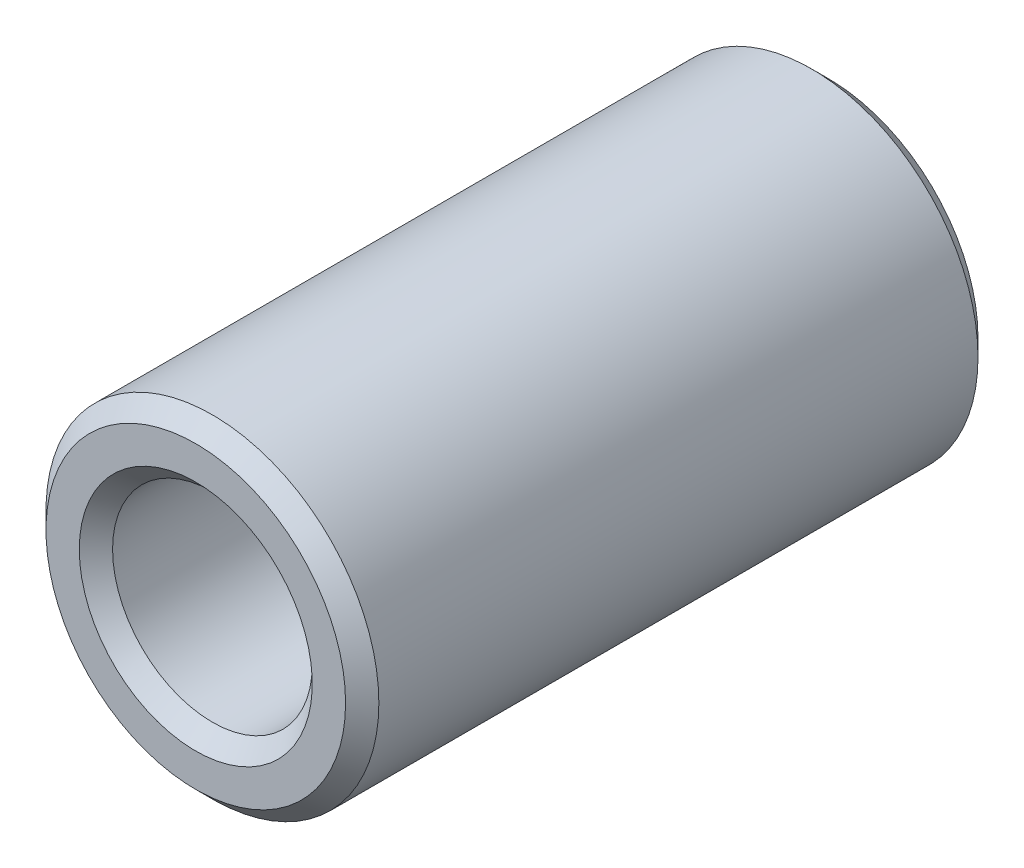
ISO-10303-21;
HEADER;
FILE_DESCRIPTION(('STEP AP214'),'2;1');
FILE_NAME('part.step','',(''),(''),'','','');
FILE_SCHEMA(('AUTOMOTIVE_DESIGN { 1 0 10303 214 1 1 1 1 }'));
ENDSEC;
DATA;
#1=APPLICATION_CONTEXT('core data for automotive mechanical design processes');
#2=APPLICATION_PROTOCOL_DEFINITION('international standard','automotive_design',2000,#1);
#3=PRODUCT_CONTEXT('',#1,'mechanical');
#4=PRODUCT('Part','Part','',(#3));
#5=PRODUCT_RELATED_PRODUCT_CATEGORY('part','',(#4));
#6=PRODUCT_DEFINITION_FORMATION('','',#4);
#7=PRODUCT_DEFINITION_CONTEXT('part definition',#1,'design');
#8=PRODUCT_DEFINITION('design','',#6,#7);
#9=PRODUCT_DEFINITION_SHAPE('','',#8);
#10=(LENGTH_UNIT() NAMED_UNIT(*) SI_UNIT(.MILLI.,.METRE.));
#11=(NAMED_UNIT(*) PLANE_ANGLE_UNIT() SI_UNIT($,.RADIAN.));
#12=(NAMED_UNIT(*) SI_UNIT($,.STERADIAN.) SOLID_ANGLE_UNIT());
#13=UNCERTAINTY_MEASURE_WITH_UNIT(LENGTH_MEASURE(1.E-05),#10,'distance_accuracy_value','');
#14=(GEOMETRIC_REPRESENTATION_CONTEXT(3) GLOBAL_UNCERTAINTY_ASSIGNED_CONTEXT((#13)) GLOBAL_UNIT_ASSIGNED_CONTEXT((#10,
#11,#12)) REPRESENTATION_CONTEXT('',''));
#15=CARTESIAN_POINT('',(0.,0.,0.));
#16=DIRECTION('',(0.,0.,1.));
#17=DIRECTION('',(1.,0.,0.));
#18=AXIS2_PLACEMENT_3D('',#15,#16,#17);
#19=CARTESIAN_POINT('',(3.,0.,-0.5));
#20=CARTESIAN_POINT('',(3.,0.,-18.5));
#21=(BOUNDED_CURVE() B_SPLINE_CURVE(1,(#19,#20),.UNSPECIFIED.,.F.,
.F.) B_SPLINE_CURVE_WITH_KNOTS((2,2),(0.,1.),
.UNSPECIFIED.) CURVE() GEOMETRIC_REPRESENTATION_ITEM() RATIONAL_B_SPLINE_CURVE((1.,1.)) REPRESENTATION_ITEM(''));
#22=CARTESIAN_POINT('',(0.,0.,0.));
#23=DIRECTION('',(0.,0.,-1.));
#24=AXIS1_PLACEMENT('',#22,#23);
#25=SURFACE_OF_REVOLUTION('',#21,#24);
#26=CARTESIAN_POINT('',(0.,0.,-0.499999999999945));
#27=DIRECTION('',(0.,0.,-1.));
#28=DIRECTION('',(-1.,0.,0.));
#29=AXIS2_PLACEMENT_3D('',#26,#27,#28);
#30=CIRCLE('',#29,3.);
#31=CARTESIAN_POINT('',(-3.,0.,-0.5));
#32=VERTEX_POINT('',#31);
#33=EDGE_CURVE('E101',#32,#32,#30,.F.);
#34=ORIENTED_EDGE('',*,*,#33,.T.);
#35=EDGE_LOOP('',(#34));
#36=FACE_BOUND('',#35,.T.);
#37=CARTESIAN_POINT('',(0.,0.,-18.5));
#38=DIRECTION('',(0.,0.,1.));
#39=DIRECTION('',(1.,0.,0.));
#40=AXIS2_PLACEMENT_3D('',#37,#38,#39);
#41=CIRCLE('',#40,3.);
#42=CARTESIAN_POINT('',(3.,0.,-18.5));
#43=VERTEX_POINT('',#42);
#44=EDGE_CURVE('E57',#43,#43,#41,.F.);
#45=ORIENTED_EDGE('',*,*,#44,.T.);
#46=EDGE_LOOP('',(#45));
#47=FACE_BOUND('',#46,.T.);
#48=ADVANCED_FACE('F53',(#36,#47),#25,.F.);
#49=CARTESIAN_POINT('',(3.,0.,-18.5));
#50=CARTESIAN_POINT('',(3.5,0.,-19.));
#51=(BOUNDED_CURVE() B_SPLINE_CURVE(1,(#49,#50),.UNSPECIFIED.,.F.,
.F.) B_SPLINE_CURVE_WITH_KNOTS((2,2),(0.,1.00000001258468),
.UNSPECIFIED.) CURVE() GEOMETRIC_REPRESENTATION_ITEM() RATIONAL_B_SPLINE_CURVE((1.,1.)) REPRESENTATION_ITEM(''));
#52=CARTESIAN_POINT('',(0.,0.,981.));
#53=DIRECTION('',(0.,0.,-1.));
#54=AXIS1_PLACEMENT('',#52,#53);
#55=SURFACE_OF_REVOLUTION('',#51,#54);
#56=ORIENTED_EDGE('',*,*,#44,.F.);
#57=EDGE_LOOP('',(#56));
#58=FACE_BOUND('',#57,.T.);
#59=CARTESIAN_POINT('',(0.,0.,-19.));
#60=DIRECTION('',(0.,0.,1.));
#61=DIRECTION('',(1.,0.,0.));
#62=AXIS2_PLACEMENT_3D('',#59,#60,#61);
#63=CIRCLE('',#62,3.5);
#64=CARTESIAN_POINT('',(3.5,0.,-19.));
#65=VERTEX_POINT('',#64);
#66=EDGE_CURVE('E96',#65,#65,#63,.T.);
#67=ORIENTED_EDGE('',*,*,#66,.F.);
#68=EDGE_LOOP('',(#67));
#69=FACE_BOUND('',#68,.T.);
#70=ADVANCED_FACE('F111',(#58,#69),#55,.F.);
#71=CARTESIAN_POINT('',(-3.,0.,-0.5));
#72=CARTESIAN_POINT('',(-3.5,0.,0.));
#73=(BOUNDED_CURVE() B_SPLINE_CURVE(1,(#71,#72),.UNSPECIFIED.,.F.,
.F.) B_SPLINE_CURVE_WITH_KNOTS((2,2),(0.,1.),
.UNSPECIFIED.) CURVE() GEOMETRIC_REPRESENTATION_ITEM() RATIONAL_B_SPLINE_CURVE((1.,1.)) REPRESENTATION_ITEM(''));
#74=CARTESIAN_POINT('',(0.,0.,-1000.));
#75=DIRECTION('',(0.,0.,1.));
#76=AXIS1_PLACEMENT('',#74,#75);
#77=SURFACE_OF_REVOLUTION('',#73,#76);
#78=ORIENTED_EDGE('',*,*,#33,.F.);
#79=EDGE_LOOP('',(#78));
#80=FACE_BOUND('',#79,.T.);
#81=CARTESIAN_POINT('',(0.,0.,0.));
#82=DIRECTION('',(0.,0.,-1.));
#83=DIRECTION('',(-1.,0.,0.));
#84=AXIS2_PLACEMENT_3D('',#81,#82,#83);
#85=CIRCLE('',#84,3.5);
#86=CARTESIAN_POINT('',(-3.5,0.,0.));
#87=VERTEX_POINT('',#86);
#88=EDGE_CURVE('E95',#87,#87,#85,.F.);
#89=ORIENTED_EDGE('',*,*,#88,.T.);
#90=EDGE_LOOP('',(#89));
#91=FACE_BOUND('',#90,.T.);
#92=ADVANCED_FACE('F114',(#80,#91),#77,.F.);
#93=CARTESIAN_POINT('',(4.554,-4.554,-19.));
#94=DIRECTION('',(0.,0.,1.));
#95=DIRECTION('',(-1.,0.,0.));
#96=AXIS2_PLACEMENT_3D('',#93,#94,#95);
#97=PLANE('',#96);
#98=ORIENTED_EDGE('',*,*,#66,.T.);
#99=EDGE_LOOP('',(#98));
#100=FACE_BOUND('',#99,.T.);
#101=CARTESIAN_POINT('',(0.,0.,-19.));
#102=DIRECTION('',(0.,0.,-1.));
#103=DIRECTION('',(-1.,0.,0.));
#104=AXIS2_PLACEMENT_3D('',#101,#102,#103);
#105=CIRCLE('',#104,4.5);
#106=CARTESIAN_POINT('',(-4.49999999999999,-5.38759106059461E-10,-19.));
#107=VERTEX_POINT('',#106);
#108=CARTESIAN_POINT('',(4.49999999999999,-1.53827571396659E-09,-19.));
#109=VERTEX_POINT('',#108);
#110=EDGE_CURVE('E91',#107,#109,#105,.F.);
#111=ORIENTED_EDGE('',*,*,#110,.F.);
#112=CARTESIAN_POINT('',(0.,0.,-19.));
#113=DIRECTION('',(0.,0.,-1.));
#114=DIRECTION('',(-1.,0.,0.));
#115=AXIS2_PLACEMENT_3D('',#112,#113,#114);
#116=CIRCLE('',#115,4.5);
#117=EDGE_CURVE('E86',#109,#107,#116,.F.);
#118=ORIENTED_EDGE('',*,*,#117,.F.);
#119=EDGE_LOOP('',(#111,#118));
#120=FACE_BOUND('',#119,.T.);
#121=ADVANCED_FACE('F90',(#100,#120),#97,.F.);
#122=CARTESIAN_POINT('',(-4.5,0.,-19.));
#123=CARTESIAN_POINT('',(-5.,0.,-18.5));
#124=(BOUNDED_CURVE() B_SPLINE_CURVE(1,(#122,#123),.UNSPECIFIED.,.F.,
.F.) B_SPLINE_CURVE_WITH_KNOTS((2,2),(0.,1.),
.UNSPECIFIED.) CURVE() GEOMETRIC_REPRESENTATION_ITEM() RATIONAL_B_SPLINE_CURVE((1.,1.)) REPRESENTATION_ITEM(''));
#125=CARTESIAN_POINT('',(0.,0.,-1018.5));
#126=DIRECTION('',(0.,0.,1.));
#127=AXIS1_PLACEMENT('',#125,#126);
#128=SURFACE_OF_REVOLUTION('',#124,#127);
#129=ORIENTED_EDGE('',*,*,#110,.T.);
#130=DIRECTION('',(-0.707106781186547,2.90060050295602E-10,-0.707106781186547));
#131=VECTOR('',#130,1.);
#132=CARTESIAN_POINT('',(4.75,-1.94848257089565E-09,-18.75));
#133=LINE('',#132,#131);
#134=CARTESIAN_POINT('',(5.00000000000002,-1.47448306427428E-09,-18.5));
#135=VERTEX_POINT('',#134);
#136=EDGE_CURVE('E83',#135,#109,#133,.T.);
#137=ORIENTED_EDGE('',*,*,#136,.F.);
#138=CARTESIAN_POINT('',(0.,0.,-18.5));
#139=DIRECTION('',(0.,0.,-1.));
#140=DIRECTION('',(-1.,0.,0.));
#141=AXIS2_PLACEMENT_3D('',#138,#139,#140);
#142=CIRCLE('',#141,5.);
#143=CARTESIAN_POINT('',(-5.,-1.02551714257666E-09,-18.5));
#144=VERTEX_POINT('',#143);
#145=EDGE_CURVE('E92',#144,#135,#142,.F.);
#146=ORIENTED_EDGE('',*,*,#145,.F.);
#147=DIRECTION('',(-0.707106781186547,-1.26986739101621E-10,0.707106781186547));
#148=VECTOR('',#147,1.);
#149=CARTESIAN_POINT('',(-4.75,-8.5303525122547E-10,-18.75));
#150=LINE('',#149,#148);
#151=EDGE_CURVE('E78',#107,#144,#150,.T.);
#152=ORIENTED_EDGE('',*,*,#151,.F.);
#153=EDGE_LOOP('',(#129,#137,#146,#152));
#154=FACE_BOUND('',#153,.T.);
#155=ADVANCED_FACE('F94',(#154),#128,.T.);
#156=CARTESIAN_POINT('',(4.554,-4.554,0.));
#157=DIRECTION('',(0.,0.,1.));
#158=DIRECTION('',(-1.,0.,0.));
#159=AXIS2_PLACEMENT_3D('',#156,#157,#158);
#160=PLANE('',#159);
#161=ORIENTED_EDGE('',*,*,#88,.F.);
#162=EDGE_LOOP('',(#161));
#163=FACE_BOUND('',#162,.T.);
#164=CARTESIAN_POINT('',(0.,0.,0.));
#165=DIRECTION('',(0.,0.,1.));
#166=DIRECTION('',(1.,0.,0.));
#167=AXIS2_PLACEMENT_3D('',#164,#165,#166);
#168=CIRCLE('',#167,4.5);
#169=CARTESIAN_POINT('',(4.5,0.,0.));
#170=VERTEX_POINT('',#169);
#171=EDGE_CURVE('E144',#170,#170,#168,.F.);
#172=ORIENTED_EDGE('',*,*,#171,.F.);
#173=EDGE_LOOP('',(#172));
#174=FACE_BOUND('',#173,.T.);
#175=ADVANCED_FACE('F55',(#163,#174),#160,.T.);
#176=CARTESIAN_POINT('',(-4.49985857864377,0.,-19.0001414213563));
#177=CARTESIAN_POINT('',(-4.5,0.,-19.));
#178=CARTESIAN_POINT('',(-5.,0.,-18.5));
#179=(BOUNDED_CURVE() B_SPLINE_CURVE(1,(#176,#177,#178),.UNSPECIFIED.,.F.,
.F.) B_SPLINE_CURVE_WITH_KNOTS((2,1,2),(-0.000282842701571811,1.08997255665599E-11,1.),
.UNSPECIFIED.) CURVE() GEOMETRIC_REPRESENTATION_ITEM() RATIONAL_B_SPLINE_CURVE((1.,1.,1.)) REPRESENTATION_ITEM(''));
#180=CARTESIAN_POINT('',(0.,0.,-1018.5));
#181=DIRECTION('',(0.,0.,1.));
#182=AXIS1_PLACEMENT('',#180,#181);
#183=SURFACE_OF_REVOLUTION('',#179,#182);
#184=ORIENTED_EDGE('',*,*,#136,.T.);
#185=ORIENTED_EDGE('',*,*,#117,.T.);
#186=ORIENTED_EDGE('',*,*,#151,.T.);
#187=CARTESIAN_POINT('',(0.,0.,-18.5));
#188=DIRECTION('',(0.,0.,-1.));
#189=DIRECTION('',(-1.,0.,0.));
#190=AXIS2_PLACEMENT_3D('',#187,#188,#189);
#191=CIRCLE('',#190,5.);
#192=EDGE_CURVE('E63',#135,#144,#191,.F.);
#193=ORIENTED_EDGE('',*,*,#192,.F.);
#194=EDGE_LOOP('',(#184,#185,#186,#193));
#195=FACE_BOUND('',#194,.T.);
#196=ADVANCED_FACE('F85',(#195),#183,.T.);
#197=CARTESIAN_POINT('',(4.5,0.,0.));
#198=CARTESIAN_POINT('',(5.,0.,-0.5));
#199=(BOUNDED_CURVE() B_SPLINE_CURVE(1,(#197,#198),.UNSPECIFIED.,.F.,
.F.) B_SPLINE_CURVE_WITH_KNOTS((2,2),(0.,1.),
.UNSPECIFIED.) CURVE() GEOMETRIC_REPRESENTATION_ITEM() RATIONAL_B_SPLINE_CURVE((1.,1.)) REPRESENTATION_ITEM(''));
#200=CARTESIAN_POINT('',(0.,0.,999.5));
#201=DIRECTION('',(0.,0.,-1.));
#202=AXIS1_PLACEMENT('',#200,#201);
#203=SURFACE_OF_REVOLUTION('',#199,#202);
#204=ORIENTED_EDGE('',*,*,#171,.T.);
#205=EDGE_LOOP('',(#204));
#206=FACE_BOUND('',#205,.T.);
#207=CARTESIAN_POINT('',(0.,0.,-0.499999999999945));
#208=DIRECTION('',(0.,0.,1.));
#209=DIRECTION('',(1.,0.,0.));
#210=AXIS2_PLACEMENT_3D('',#207,#208,#209);
#211=CIRCLE('',#210,5.);
#212=CARTESIAN_POINT('',(5.,0.,-0.5));
#213=VERTEX_POINT('',#212);
#214=EDGE_CURVE('E11',#213,#213,#211,.F.);
#215=ORIENTED_EDGE('',*,*,#214,.F.);
#216=EDGE_LOOP('',(#215));
#217=FACE_BOUND('',#216,.T.);
#218=ADVANCED_FACE('F150',(#206,#217),#203,.T.);
#219=CARTESIAN_POINT('',(5.,0.,-0.5));
#220=CARTESIAN_POINT('',(5.,0.,-18.5));
#221=(BOUNDED_CURVE() B_SPLINE_CURVE(1,(#219,#220),.UNSPECIFIED.,.F.,
.F.) B_SPLINE_CURVE_WITH_KNOTS((2,2),(0.,1.),
.UNSPECIFIED.) CURVE() GEOMETRIC_REPRESENTATION_ITEM() RATIONAL_B_SPLINE_CURVE((1.,1.)) REPRESENTATION_ITEM(''));
#222=CARTESIAN_POINT('',(0.,0.,0.));
#223=DIRECTION('',(0.,0.,-1.));
#224=AXIS1_PLACEMENT('',#222,#223);
#225=SURFACE_OF_REVOLUTION('',#221,#224);
#226=ORIENTED_EDGE('',*,*,#192,.T.);
#227=ORIENTED_EDGE('',*,*,#145,.T.);
#228=EDGE_LOOP('',(#226,#227));
#229=FACE_BOUND('',#228,.T.);
#230=ORIENTED_EDGE('',*,*,#214,.T.);
#231=EDGE_LOOP('',(#230));
#232=FACE_BOUND('',#231,.T.);
#233=ADVANCED_FACE('F147',(#229,#232),#225,.T.);
#234=CLOSED_SHELL('',(#48,#70,#92,#121,#155,#175,#196,#218,#233));
#235=MANIFOLD_SOLID_BREP('B2',#234);
#236=ADVANCED_BREP_SHAPE_REPRESENTATION('',(#18,#235),#14);
#237=SHAPE_DEFINITION_REPRESENTATION(#9,#236);
ENDSEC;
END-ISO-10303-21;
